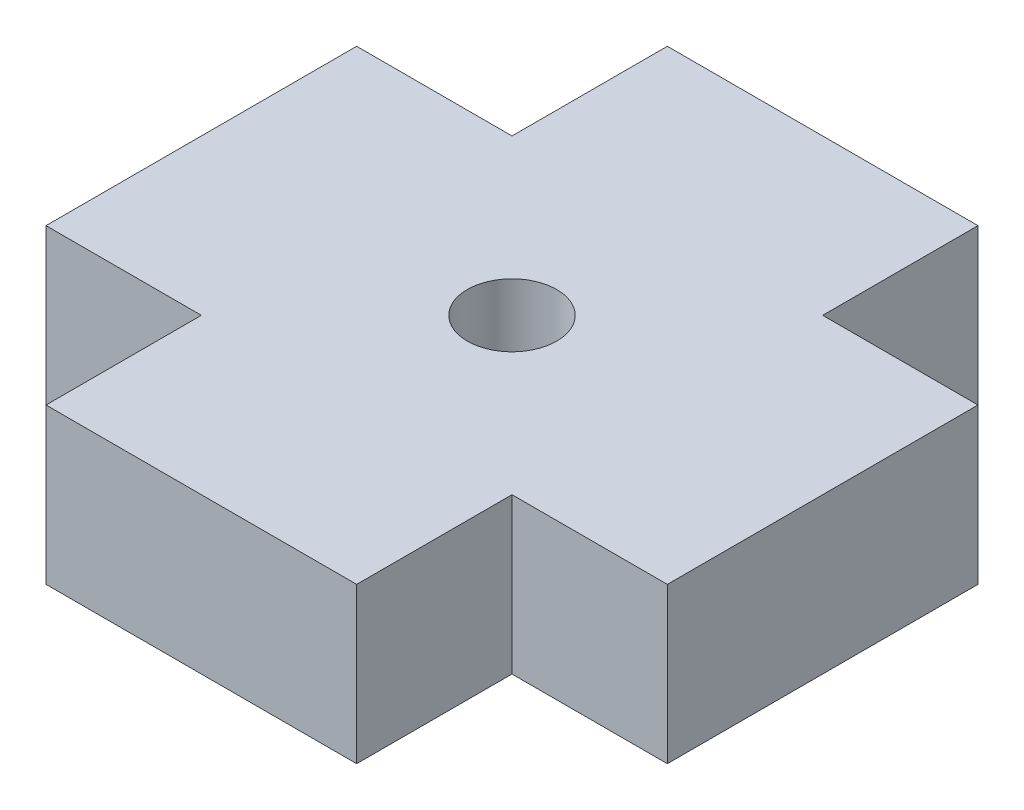
ISO-10303-21;
HEADER;
FILE_DESCRIPTION(('STEP AP214'),'2;1');
FILE_NAME('part.step','',(''),(''),'','','');
FILE_SCHEMA(('AUTOMOTIVE_DESIGN { 1 0 10303 214 1 1 1 1 }'));
ENDSEC;
DATA;
#1=APPLICATION_CONTEXT('core data for automotive mechanical design processes');
#2=APPLICATION_PROTOCOL_DEFINITION('international standard','automotive_design',2000,#1);
#3=PRODUCT_CONTEXT('',#1,'mechanical');
#4=PRODUCT('Part','Part','',(#3));
#5=PRODUCT_RELATED_PRODUCT_CATEGORY('part','',(#4));
#6=PRODUCT_DEFINITION_FORMATION('','',#4);
#7=PRODUCT_DEFINITION_CONTEXT('part definition',#1,'design');
#8=PRODUCT_DEFINITION('design','',#6,#7);
#9=PRODUCT_DEFINITION_SHAPE('','',#8);
#10=(LENGTH_UNIT() NAMED_UNIT(*) SI_UNIT(.MILLI.,.METRE.));
#11=(NAMED_UNIT(*) PLANE_ANGLE_UNIT() SI_UNIT($,.RADIAN.));
#12=(NAMED_UNIT(*) SI_UNIT($,.STERADIAN.) SOLID_ANGLE_UNIT());
#13=UNCERTAINTY_MEASURE_WITH_UNIT(LENGTH_MEASURE(1.E-05),#10,'distance_accuracy_value','');
#14=(GEOMETRIC_REPRESENTATION_CONTEXT(3) GLOBAL_UNCERTAINTY_ASSIGNED_CONTEXT((#13)) GLOBAL_UNIT_ASSIGNED_CONTEXT((#10,
#11,#12)) REPRESENTATION_CONTEXT('',''));
#15=CARTESIAN_POINT('',(0.,0.,0.));
#16=DIRECTION('',(0.,0.,1.));
#17=DIRECTION('',(1.,0.,0.));
#18=AXIS2_PLACEMENT_3D('',#15,#16,#17);
#19=CARTESIAN_POINT('',(12.7,6.35,0.));
#20=DIRECTION('',(1.,0.,0.));
#21=DIRECTION('',(0.,0.,-1.));
#22=AXIS2_PLACEMENT_3D('',#19,#20,#21);
#23=PLANE('',#22);
#24=DIRECTION('',(0.,0.,1.));
#25=VECTOR('',#24,1.);
#26=CARTESIAN_POINT('',(12.7,0.,0.));
#27=LINE('',#26,#25);
#28=CARTESIAN_POINT('',(12.7,0.,0.));
#29=VERTEX_POINT('',#28);
#30=CARTESIAN_POINT('',(12.7,0.,6.34999999999999));
#31=VERTEX_POINT('',#30);
#32=EDGE_CURVE('E210',#29,#31,#27,.T.);
#33=ORIENTED_EDGE('',*,*,#32,.F.);
#34=DIRECTION('',(0.,-1.,0.));
#35=VECTOR('',#34,1.);
#36=CARTESIAN_POINT('',(12.7,6.35,0.));
#37=LINE('',#36,#35);
#38=CARTESIAN_POINT('',(12.7,6.35,0.));
#39=VERTEX_POINT('',#38);
#40=EDGE_CURVE('E11',#39,#29,#37,.T.);
#41=ORIENTED_EDGE('',*,*,#40,.F.);
#42=DIRECTION('',(0.,0.,1.));
#43=VECTOR('',#42,1.);
#44=CARTESIAN_POINT('',(12.7,6.35,0.));
#45=LINE('',#44,#43);
#46=CARTESIAN_POINT('',(12.7,6.35,6.34999999999999));
#47=VERTEX_POINT('',#46);
#48=EDGE_CURVE('E308',#39,#47,#45,.T.);
#49=ORIENTED_EDGE('',*,*,#48,.T.);
#50=DIRECTION('',(0.,-1.,0.));
#51=VECTOR('',#50,1.);
#52=CARTESIAN_POINT('',(12.7,6.35,6.34999999999999));
#53=LINE('',#52,#51);
#54=EDGE_CURVE('E59',#47,#31,#53,.T.);
#55=ORIENTED_EDGE('',*,*,#54,.T.);
#56=EDGE_LOOP('',(#33,#41,#49,#55));
#57=FACE_BOUND('',#56,.T.);
#58=ADVANCED_FACE('F41',(#57),#23,.T.);
#59=CARTESIAN_POINT('',(0.,6.35,0.));
#60=DIRECTION('',(0.,0.,-1.));
#61=DIRECTION('',(-1.,0.,0.));
#62=AXIS2_PLACEMENT_3D('',#59,#60,#61);
#63=PLANE('',#62);
#64=DIRECTION('',(1.,0.,0.));
#65=VECTOR('',#64,1.);
#66=CARTESIAN_POINT('',(0.,0.,0.));
#67=LINE('',#66,#65);
#68=CARTESIAN_POINT('',(0.,0.,0.));
#69=VERTEX_POINT('',#68);
#70=EDGE_CURVE('E202',#69,#29,#67,.T.);
#71=ORIENTED_EDGE('',*,*,#70,.F.);
#72=DIRECTION('',(0.,-1.,0.));
#73=VECTOR('',#72,1.);
#74=CARTESIAN_POINT('',(0.,6.35,0.));
#75=LINE('',#74,#73);
#76=CARTESIAN_POINT('',(0.,6.35,0.));
#77=VERTEX_POINT('',#76);
#78=EDGE_CURVE('E51',#77,#69,#75,.T.);
#79=ORIENTED_EDGE('',*,*,#78,.F.);
#80=DIRECTION('',(1.,0.,0.));
#81=VECTOR('',#80,1.);
#82=CARTESIAN_POINT('',(0.,6.35,0.));
#83=LINE('',#82,#81);
#84=EDGE_CURVE('E303',#77,#39,#83,.T.);
#85=ORIENTED_EDGE('',*,*,#84,.T.);
#86=ORIENTED_EDGE('',*,*,#40,.T.);
#87=EDGE_LOOP('',(#71,#79,#85,#86));
#88=FACE_BOUND('',#87,.T.);
#89=ADVANCED_FACE('F208',(#88),#63,.T.);
#90=CARTESIAN_POINT('',(0.,6.35,0.));
#91=DIRECTION('',(1.,0.,0.));
#92=DIRECTION('',(0.,0.,-1.));
#93=AXIS2_PLACEMENT_3D('',#90,#91,#92);
#94=PLANE('',#93);
#95=DIRECTION('',(0.,0.,1.));
#96=VECTOR('',#95,1.);
#97=CARTESIAN_POINT('',(0.,0.,0.));
#98=LINE('',#97,#96);
#99=CARTESIAN_POINT('',(0.,0.,6.35));
#100=VERTEX_POINT('',#99);
#101=EDGE_CURVE('E192',#69,#100,#98,.T.);
#102=ORIENTED_EDGE('',*,*,#101,.T.);
#103=DIRECTION('',(0.,-1.,0.));
#104=VECTOR('',#103,1.);
#105=CARTESIAN_POINT('',(0.,6.35,6.35));
#106=LINE('',#105,#104);
#107=CARTESIAN_POINT('',(0.,6.35,6.35));
#108=VERTEX_POINT('',#107);
#109=EDGE_CURVE('E182',#108,#100,#106,.T.);
#110=ORIENTED_EDGE('',*,*,#109,.F.);
#111=DIRECTION('',(0.,0.,1.));
#112=VECTOR('',#111,1.);
#113=CARTESIAN_POINT('',(0.,6.35,0.));
#114=LINE('',#113,#112);
#115=EDGE_CURVE('E194',#77,#108,#114,.T.);
#116=ORIENTED_EDGE('',*,*,#115,.F.);
#117=ORIENTED_EDGE('',*,*,#78,.T.);
#118=EDGE_LOOP('',(#102,#110,#116,#117));
#119=FACE_BOUND('',#118,.T.);
#120=ADVANCED_FACE('F190',(#119),#94,.F.);
#121=CARTESIAN_POINT('',(0.,6.35,6.35));
#122=DIRECTION('',(0.,0.,1.));
#123=DIRECTION('',(1.,0.,0.));
#124=AXIS2_PLACEMENT_3D('',#121,#122,#123);
#125=PLANE('',#124);
#126=DIRECTION('',(-1.,0.,0.));
#127=VECTOR('',#126,1.);
#128=CARTESIAN_POINT('',(0.,0.,6.35));
#129=LINE('',#128,#127);
#130=CARTESIAN_POINT('',(-6.35,0.,6.35));
#131=VERTEX_POINT('',#130);
#132=EDGE_CURVE('E204',#100,#131,#129,.T.);
#133=ORIENTED_EDGE('',*,*,#132,.T.);
#134=DIRECTION('',(0.,-1.,0.));
#135=VECTOR('',#134,1.);
#136=CARTESIAN_POINT('',(-6.35,6.35,6.35));
#137=LINE('',#136,#135);
#138=CARTESIAN_POINT('',(-6.35,6.35,6.35));
#139=VERTEX_POINT('',#138);
#140=EDGE_CURVE('E178',#139,#131,#137,.T.);
#141=ORIENTED_EDGE('',*,*,#140,.F.);
#142=DIRECTION('',(-1.,0.,0.));
#143=VECTOR('',#142,1.);
#144=CARTESIAN_POINT('',(0.,6.35,6.35));
#145=LINE('',#144,#143);
#146=EDGE_CURVE('E300',#108,#139,#145,.T.);
#147=ORIENTED_EDGE('',*,*,#146,.F.);
#148=ORIENTED_EDGE('',*,*,#109,.T.);
#149=EDGE_LOOP('',(#133,#141,#147,#148));
#150=FACE_BOUND('',#149,.T.);
#151=ADVANCED_FACE('F299',(#150),#125,.F.);
#152=CARTESIAN_POINT('',(-6.35,6.35,0.));
#153=DIRECTION('',(1.,0.,0.));
#154=DIRECTION('',(0.,0.,-1.));
#155=AXIS2_PLACEMENT_3D('',#152,#153,#154);
#156=PLANE('',#155);
#157=DIRECTION('',(0.,0.,1.));
#158=VECTOR('',#157,1.);
#159=CARTESIAN_POINT('',(-6.35,0.,0.));
#160=LINE('',#159,#158);
#161=CARTESIAN_POINT('',(-6.35,0.,19.05));
#162=VERTEX_POINT('',#161);
#163=EDGE_CURVE('E220',#131,#162,#160,.T.);
#164=ORIENTED_EDGE('',*,*,#163,.T.);
#165=DIRECTION('',(0.,-1.,0.));
#166=VECTOR('',#165,1.);
#167=CARTESIAN_POINT('',(-6.35,6.35,19.05));
#168=LINE('',#167,#166);
#169=CARTESIAN_POINT('',(-6.35,6.35,19.05));
#170=VERTEX_POINT('',#169);
#171=EDGE_CURVE('E175',#170,#162,#168,.T.);
#172=ORIENTED_EDGE('',*,*,#171,.F.);
#173=DIRECTION('',(0.,0.,1.));
#174=VECTOR('',#173,1.);
#175=CARTESIAN_POINT('',(-6.35,6.35,0.));
#176=LINE('',#175,#174);
#177=EDGE_CURVE('E296',#139,#170,#176,.T.);
#178=ORIENTED_EDGE('',*,*,#177,.F.);
#179=ORIENTED_EDGE('',*,*,#140,.T.);
#180=EDGE_LOOP('',(#164,#172,#178,#179));
#181=FACE_BOUND('',#180,.T.);
#182=ADVANCED_FACE('F294',(#181),#156,.F.);
#183=CARTESIAN_POINT('',(0.,6.35,19.05));
#184=DIRECTION('',(0.,0.,1.));
#185=DIRECTION('',(1.,0.,0.));
#186=AXIS2_PLACEMENT_3D('',#183,#184,#185);
#187=PLANE('',#186);
#188=DIRECTION('',(-1.,0.,0.));
#189=VECTOR('',#188,1.);
#190=CARTESIAN_POINT('',(0.,0.,19.05));
#191=LINE('',#190,#189);
#192=CARTESIAN_POINT('',(0.,0.,19.05));
#193=VERTEX_POINT('',#192);
#194=EDGE_CURVE('E224',#193,#162,#191,.T.);
#195=ORIENTED_EDGE('',*,*,#194,.F.);
#196=DIRECTION('',(0.,-1.,0.));
#197=VECTOR('',#196,1.);
#198=CARTESIAN_POINT('',(0.,6.35,19.05));
#199=LINE('',#198,#197);
#200=CARTESIAN_POINT('',(0.,6.35,19.05));
#201=VERTEX_POINT('',#200);
#202=EDGE_CURVE('E172',#201,#193,#199,.T.);
#203=ORIENTED_EDGE('',*,*,#202,.F.);
#204=DIRECTION('',(-1.,0.,0.));
#205=VECTOR('',#204,1.);
#206=CARTESIAN_POINT('',(0.,6.35,19.05));
#207=LINE('',#206,#205);
#208=EDGE_CURVE('E292',#201,#170,#207,.T.);
#209=ORIENTED_EDGE('',*,*,#208,.T.);
#210=ORIENTED_EDGE('',*,*,#171,.T.);
#211=EDGE_LOOP('',(#195,#203,#209,#210));
#212=FACE_BOUND('',#211,.T.);
#213=ADVANCED_FACE('F288',(#212),#187,.T.);
#214=CARTESIAN_POINT('',(0.,0.,25.4));
#215=VERTEX_POINT('',#214);
#216=EDGE_CURVE('E207',#193,#215,#98,.T.);
#217=ORIENTED_EDGE('',*,*,#216,.T.);
#218=DIRECTION('',(0.,-1.,0.));
#219=VECTOR('',#218,1.);
#220=CARTESIAN_POINT('',(0.,6.35,25.4));
#221=LINE('',#220,#219);
#222=CARTESIAN_POINT('',(0.,6.35,25.4));
#223=VERTEX_POINT('',#222);
#224=EDGE_CURVE('E168',#223,#215,#221,.T.);
#225=ORIENTED_EDGE('',*,*,#224,.F.);
#226=EDGE_CURVE('E306',#201,#223,#114,.T.);
#227=ORIENTED_EDGE('',*,*,#226,.F.);
#228=ORIENTED_EDGE('',*,*,#202,.T.);
#229=EDGE_LOOP('',(#217,#225,#227,#228));
#230=FACE_BOUND('',#229,.T.);
#231=ADVANCED_FACE('F274',(#230),#94,.F.);
#232=CARTESIAN_POINT('',(0.,6.35,25.4));
#233=DIRECTION('',(0.,0.,-1.));
#234=DIRECTION('',(-1.,0.,0.));
#235=AXIS2_PLACEMENT_3D('',#232,#233,#234);
#236=PLANE('',#235);
#237=DIRECTION('',(1.,0.,0.));
#238=VECTOR('',#237,1.);
#239=CARTESIAN_POINT('',(0.,0.,25.4));
#240=LINE('',#239,#238);
#241=CARTESIAN_POINT('',(12.7,0.,25.4));
#242=VERTEX_POINT('',#241);
#243=EDGE_CURVE('E228',#215,#242,#240,.T.);
#244=ORIENTED_EDGE('',*,*,#243,.T.);
#245=DIRECTION('',(0.,-1.,0.));
#246=VECTOR('',#245,1.);
#247=CARTESIAN_POINT('',(12.7,6.35,25.4));
#248=LINE('',#247,#246);
#249=CARTESIAN_POINT('',(12.7,6.35,25.4));
#250=VERTEX_POINT('',#249);
#251=EDGE_CURVE('E161',#250,#242,#248,.T.);
#252=ORIENTED_EDGE('',*,*,#251,.F.);
#253=DIRECTION('',(1.,0.,0.));
#254=VECTOR('',#253,1.);
#255=CARTESIAN_POINT('',(0.,6.35,25.4));
#256=LINE('',#255,#254);
#257=EDGE_CURVE('E312',#223,#250,#256,.T.);
#258=ORIENTED_EDGE('',*,*,#257,.F.);
#259=ORIENTED_EDGE('',*,*,#224,.T.);
#260=EDGE_LOOP('',(#244,#252,#258,#259));
#261=FACE_BOUND('',#260,.T.);
#262=ADVANCED_FACE('F268',(#261),#236,.F.);
#263=CARTESIAN_POINT('',(12.7,0.,19.05));
#264=VERTEX_POINT('',#263);
#265=EDGE_CURVE('E215',#264,#242,#27,.T.);
#266=ORIENTED_EDGE('',*,*,#265,.F.);
#267=DIRECTION('',(0.,-1.,0.));
#268=VECTOR('',#267,1.);
#269=CARTESIAN_POINT('',(12.7,6.35,19.05));
#270=LINE('',#269,#268);
#271=CARTESIAN_POINT('',(12.7,6.35,19.05));
#272=VERTEX_POINT('',#271);
#273=EDGE_CURVE('E157',#272,#264,#270,.T.);
#274=ORIENTED_EDGE('',*,*,#273,.F.);
#275=EDGE_CURVE('E149',#272,#250,#45,.T.);
#276=ORIENTED_EDGE('',*,*,#275,.T.);
#277=ORIENTED_EDGE('',*,*,#251,.T.);
#278=EDGE_LOOP('',(#266,#274,#276,#277));
#279=FACE_BOUND('',#278,.T.);
#280=ADVANCED_FACE('F261',(#279),#23,.T.);
#281=CARTESIAN_POINT('',(0.,6.35,19.05));
#282=DIRECTION('',(0.,0.,-1.));
#283=DIRECTION('',(-1.,0.,0.));
#284=AXIS2_PLACEMENT_3D('',#281,#282,#283);
#285=PLANE('',#284);
#286=DIRECTION('',(1.,0.,0.));
#287=VECTOR('',#286,1.);
#288=CARTESIAN_POINT('',(0.,0.,19.05));
#289=LINE('',#288,#287);
#290=CARTESIAN_POINT('',(19.05,0.,19.05));
#291=VERTEX_POINT('',#290);
#292=EDGE_CURVE('E155',#264,#291,#289,.T.);
#293=ORIENTED_EDGE('',*,*,#292,.T.);
#294=DIRECTION('',(0.,-1.,0.));
#295=VECTOR('',#294,1.);
#296=CARTESIAN_POINT('',(19.05,6.35,19.05));
#297=LINE('',#296,#295);
#298=CARTESIAN_POINT('',(19.05,6.35,19.05));
#299=VERTEX_POINT('',#298);
#300=EDGE_CURVE('E137',#299,#291,#297,.T.);
#301=ORIENTED_EDGE('',*,*,#300,.F.);
#302=DIRECTION('',(1.,0.,0.));
#303=VECTOR('',#302,1.);
#304=CARTESIAN_POINT('',(0.,6.35,19.05));
#305=LINE('',#304,#303);
#306=EDGE_CURVE('E143',#272,#299,#305,.T.);
#307=ORIENTED_EDGE('',*,*,#306,.F.);
#308=ORIENTED_EDGE('',*,*,#273,.T.);
#309=EDGE_LOOP('',(#293,#301,#307,#308));
#310=FACE_BOUND('',#309,.T.);
#311=ADVANCED_FACE('F153',(#310),#285,.F.);
#312=CARTESIAN_POINT('',(19.05,6.35,0.));
#313=DIRECTION('',(-1.,0.,0.));
#314=DIRECTION('',(0.,0.,1.));
#315=AXIS2_PLACEMENT_3D('',#312,#313,#314);
#316=PLANE('',#315);
#317=DIRECTION('',(0.,0.,-1.));
#318=VECTOR('',#317,1.);
#319=CARTESIAN_POINT('',(19.05,0.,0.));
#320=LINE('',#319,#318);
#321=CARTESIAN_POINT('',(19.05,0.,6.35));
#322=VERTEX_POINT('',#321);
#323=EDGE_CURVE('E234',#291,#322,#320,.T.);
#324=ORIENTED_EDGE('',*,*,#323,.T.);
#325=DIRECTION('',(0.,-1.,0.));
#326=VECTOR('',#325,1.);
#327=CARTESIAN_POINT('',(19.05,6.35,6.35));
#328=LINE('',#327,#326);
#329=CARTESIAN_POINT('',(19.05,6.35,6.35));
#330=VERTEX_POINT('',#329);
#331=EDGE_CURVE('E97',#330,#322,#328,.T.);
#332=ORIENTED_EDGE('',*,*,#331,.F.);
#333=DIRECTION('',(0.,0.,-1.));
#334=VECTOR('',#333,1.);
#335=CARTESIAN_POINT('',(19.05,6.35,0.));
#336=LINE('',#335,#334);
#337=EDGE_CURVE('E133',#299,#330,#336,.T.);
#338=ORIENTED_EDGE('',*,*,#337,.F.);
#339=ORIENTED_EDGE('',*,*,#300,.T.);
#340=EDGE_LOOP('',(#324,#332,#338,#339));
#341=FACE_BOUND('',#340,.T.);
#342=ADVANCED_FACE('F135',(#341),#316,.F.);
#343=CARTESIAN_POINT('',(6.35,6.35,12.7));
#344=DIRECTION('',(0.,-1.,0.));
#345=DIRECTION('',(0.,0.,-1.));
#346=AXIS2_PLACEMENT_3D('',#343,#344,#345);
#347=CYLINDRICAL_SURFACE('',#346,1.8288);
#348=CARTESIAN_POINT('',(6.35,6.35,12.7));
#349=DIRECTION('',(0.,1.,0.));
#350=DIRECTION('',(0.,0.,1.));
#351=AXIS2_PLACEMENT_3D('',#348,#349,#350);
#352=CIRCLE('',#351,1.8288);
#353=CARTESIAN_POINT('',(6.35,6.35,14.5288));
#354=VERTEX_POINT('',#353);
#355=EDGE_CURVE('E240',#354,#354,#352,.T.);
#356=ORIENTED_EDGE('',*,*,#355,.T.);
#357=EDGE_LOOP('',(#356));
#358=FACE_BOUND('',#357,.T.);
#359=CARTESIAN_POINT('',(6.35,0.,12.7));
#360=DIRECTION('',(0.,1.,0.));
#361=DIRECTION('',(0.,0.,1.));
#362=AXIS2_PLACEMENT_3D('',#359,#360,#361);
#363=CIRCLE('',#362,1.8288);
#364=CARTESIAN_POINT('',(6.35,0.,14.5288));
#365=VERTEX_POINT('',#364);
#366=EDGE_CURVE('E213',#365,#365,#363,.T.);
#367=ORIENTED_EDGE('',*,*,#366,.F.);
#368=EDGE_LOOP('',(#367));
#369=FACE_BOUND('',#368,.T.);
#370=ADVANCED_FACE('F43',(#358,#369),#347,.F.);
#371=CARTESIAN_POINT('',(0.,6.35,6.34999999999998));
#372=DIRECTION('',(0.,0.,-1.));
#373=DIRECTION('',(-1.,0.,0.));
#374=AXIS2_PLACEMENT_3D('',#371,#372,#373);
#375=PLANE('',#374);
#376=DIRECTION('',(1.,0.,0.));
#377=VECTOR('',#376,1.);
#378=CARTESIAN_POINT('',(0.,0.,6.34999999999998));
#379=LINE('',#378,#377);
#380=EDGE_CURVE('E237',#31,#322,#379,.T.);
#381=ORIENTED_EDGE('',*,*,#380,.F.);
#382=ORIENTED_EDGE('',*,*,#54,.F.);
#383=DIRECTION('',(1.,0.,0.));
#384=VECTOR('',#383,1.);
#385=CARTESIAN_POINT('',(0.,6.35,6.34999999999998));
#386=LINE('',#385,#384);
#387=EDGE_CURVE('E142',#47,#330,#386,.T.);
#388=ORIENTED_EDGE('',*,*,#387,.T.);
#389=ORIENTED_EDGE('',*,*,#331,.T.);
#390=EDGE_LOOP('',(#381,#382,#388,#389));
#391=FACE_BOUND('',#390,.T.);
#392=ADVANCED_FACE('F250',(#391),#375,.T.);
#393=CARTESIAN_POINT('',(0.,6.35,0.));
#394=DIRECTION('',(0.,1.,0.));
#395=DIRECTION('',(0.,0.,1.));
#396=AXIS2_PLACEMENT_3D('',#393,#394,#395);
#397=PLANE('',#396);
#398=ORIENTED_EDGE('',*,*,#355,.F.);
#399=EDGE_LOOP('',(#398));
#400=FACE_BOUND('',#399,.T.);
#401=ORIENTED_EDGE('',*,*,#48,.F.);
#402=ORIENTED_EDGE('',*,*,#84,.F.);
#403=ORIENTED_EDGE('',*,*,#115,.T.);
#404=ORIENTED_EDGE('',*,*,#146,.T.);
#405=ORIENTED_EDGE('',*,*,#177,.T.);
#406=ORIENTED_EDGE('',*,*,#208,.F.);
#407=ORIENTED_EDGE('',*,*,#226,.T.);
#408=ORIENTED_EDGE('',*,*,#257,.T.);
#409=ORIENTED_EDGE('',*,*,#275,.F.);
#410=ORIENTED_EDGE('',*,*,#306,.T.);
#411=ORIENTED_EDGE('',*,*,#337,.T.);
#412=ORIENTED_EDGE('',*,*,#387,.F.);
#413=EDGE_LOOP('',(#401,#402,#403,#404,#405,#406,#407,#408,#409,#410,#411,#412));
#414=FACE_BOUND('',#413,.T.);
#415=ADVANCED_FACE('F147',(#400,#414),#397,.T.);
#416=CARTESIAN_POINT('',(0.,0.,0.));
#417=DIRECTION('',(0.,1.,0.));
#418=DIRECTION('',(0.,0.,1.));
#419=AXIS2_PLACEMENT_3D('',#416,#417,#418);
#420=PLANE('',#419);
#421=ORIENTED_EDGE('',*,*,#366,.T.);
#422=EDGE_LOOP('',(#421));
#423=FACE_BOUND('',#422,.T.);
#424=ORIENTED_EDGE('',*,*,#32,.T.);
#425=ORIENTED_EDGE('',*,*,#380,.T.);
#426=ORIENTED_EDGE('',*,*,#323,.F.);
#427=ORIENTED_EDGE('',*,*,#292,.F.);
#428=ORIENTED_EDGE('',*,*,#265,.T.);
#429=ORIENTED_EDGE('',*,*,#243,.F.);
#430=ORIENTED_EDGE('',*,*,#216,.F.);
#431=ORIENTED_EDGE('',*,*,#194,.T.);
#432=ORIENTED_EDGE('',*,*,#163,.F.);
#433=ORIENTED_EDGE('',*,*,#132,.F.);
#434=ORIENTED_EDGE('',*,*,#101,.F.);
#435=ORIENTED_EDGE('',*,*,#70,.T.);
#436=EDGE_LOOP('',(#424,#425,#426,#427,#428,#429,#430,#431,#432,#433,#434,#435));
#437=FACE_BOUND('',#436,.T.);
#438=ADVANCED_FACE('F201',(#423,#437),#420,.F.);
#439=CLOSED_SHELL('',(#58,#89,#120,#151,#182,#213,#231,#262,#280,#311,#342,#370,#392,#415,#438));
#440=MANIFOLD_SOLID_BREP('B2',#439);
#441=ADVANCED_BREP_SHAPE_REPRESENTATION('',(#18,#440),#14);
#442=SHAPE_DEFINITION_REPRESENTATION(#9,#441);
ENDSEC;
END-ISO-10303-21;
